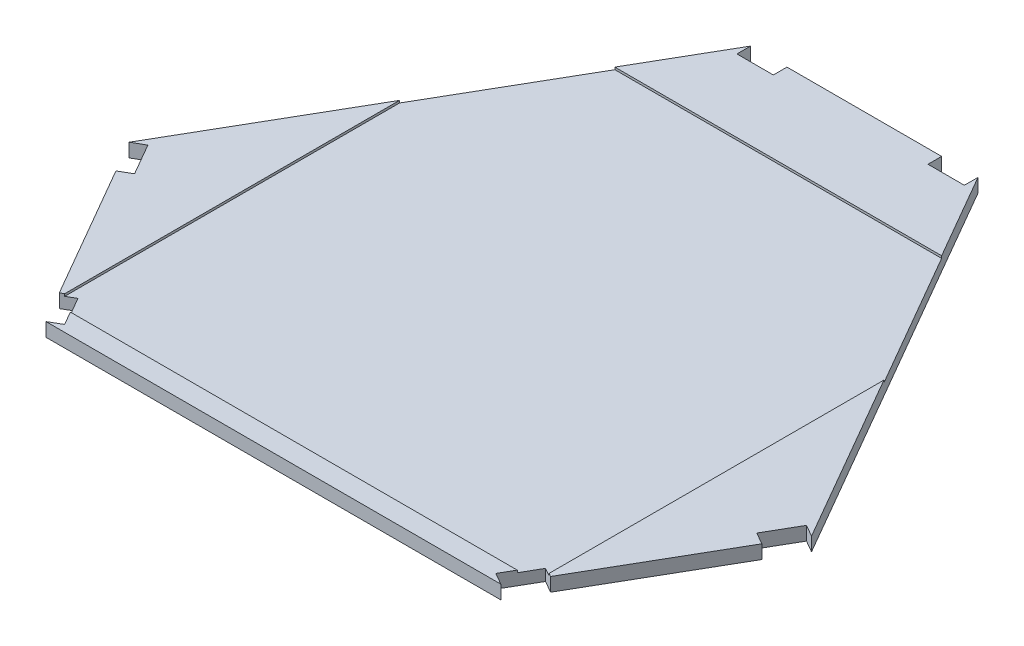
ISO-10303-21;
HEADER;
FILE_DESCRIPTION(('STEP AP214'),'2;1');
FILE_NAME('part.step','',(''),(''),'','','');
FILE_SCHEMA(('AUTOMOTIVE_DESIGN { 1 0 10303 214 1 1 1 1 }'));
ENDSEC;
DATA;
#1=APPLICATION_CONTEXT('core data for automotive mechanical design processes');
#2=APPLICATION_PROTOCOL_DEFINITION('international standard','automotive_design',2000,#1);
#3=PRODUCT_CONTEXT('',#1,'mechanical');
#4=PRODUCT('Part','Part','',(#3));
#5=PRODUCT_RELATED_PRODUCT_CATEGORY('part','',(#4));
#6=PRODUCT_DEFINITION_FORMATION('','',#4);
#7=PRODUCT_DEFINITION_CONTEXT('part definition',#1,'design');
#8=PRODUCT_DEFINITION('design','',#6,#7);
#9=PRODUCT_DEFINITION_SHAPE('','',#8);
#10=(LENGTH_UNIT() NAMED_UNIT(*) SI_UNIT(.MILLI.,.METRE.));
#11=(NAMED_UNIT(*) PLANE_ANGLE_UNIT() SI_UNIT($,.RADIAN.));
#12=(NAMED_UNIT(*) SI_UNIT($,.STERADIAN.) SOLID_ANGLE_UNIT());
#13=UNCERTAINTY_MEASURE_WITH_UNIT(LENGTH_MEASURE(1.E-05),#10,'distance_accuracy_value','');
#14=(GEOMETRIC_REPRESENTATION_CONTEXT(3) GLOBAL_UNCERTAINTY_ASSIGNED_CONTEXT((#13)) GLOBAL_UNIT_ASSIGNED_CONTEXT((#10,
#11,#12)) REPRESENTATION_CONTEXT('',''));
#15=CARTESIAN_POINT('',(0.,0.,0.));
#16=DIRECTION('',(0.,0.,1.));
#17=DIRECTION('',(1.,0.,0.));
#18=AXIS2_PLACEMENT_3D('',#15,#16,#17);
#19=CARTESIAN_POINT('',(0.,0.,0.));
#20=DIRECTION('',(0.,-1.,0.));
#21=DIRECTION('',(0.,0.,-1.));
#22=AXIS2_PLACEMENT_3D('',#19,#20,#21);
#23=PLANE('',#22);
#24=DIRECTION('',(0.866025403784436,0.,-0.500000000000004));
#25=VECTOR('',#24,1.);
#26=CARTESIAN_POINT('',(-74.9999999999997,0.,14.4337572661108));
#27=LINE('',#26,#25);
#28=CARTESIAN_POINT('',(-74.9999999999997,0.,14.4337572661108));
#29=VERTEX_POINT('',#28);
#30=CARTESIAN_POINT('',(-72.4019237886464,0.,12.9337572661108));
#31=VERTEX_POINT('',#30);
#32=EDGE_CURVE('E250',#29,#31,#27,.T.);
#33=ORIENTED_EDGE('',*,*,#32,.F.);
#34=DIRECTION('',(-0.499999999999997,0.,0.866025403784441));
#35=VECTOR('',#34,1.);
#36=CARTESIAN_POINT('',(-75.0000004645097,0.,14.4337564615561));
#37=LINE('',#36,#35);
#38=CARTESIAN_POINT('',(-24.99999953549,0.,-72.1687839168879));
#39=VERTEX_POINT('',#38);
#40=EDGE_CURVE('E430',#39,#29,#37,.T.);
#41=ORIENTED_EDGE('',*,*,#40,.F.);
#42=DIRECTION('',(0.,0.,1.));
#43=VECTOR('',#42,1.);
#44=CARTESIAN_POINT('',(-24.99999953549,0.,-72.1687839168879));
#45=LINE('',#44,#43);
#46=CARTESIAN_POINT('',(-24.99999953549,0.,-69.1687839168879));
#47=VERTEX_POINT('',#46);
#48=EDGE_CURVE('E359',#39,#47,#45,.T.);
#49=ORIENTED_EDGE('',*,*,#48,.T.);
#50=DIRECTION('',(1.,0.,0.));
#51=VECTOR('',#50,1.);
#52=CARTESIAN_POINT('',(-24.99999953549,0.,-69.1687839168879));
#53=LINE('',#52,#51);
#54=CARTESIAN_POINT('',(-16.99999953549,0.,-69.1687839168879));
#55=VERTEX_POINT('',#54);
#56=EDGE_CURVE('E363',#47,#55,#53,.T.);
#57=ORIENTED_EDGE('',*,*,#56,.T.);
#58=DIRECTION('',(0.,0.,-1.));
#59=VECTOR('',#58,1.);
#60=CARTESIAN_POINT('',(-16.99999953549,0.,-72.1687839168879));
#61=LINE('',#60,#59);
#62=CARTESIAN_POINT('',(-16.99999953549,0.,-72.1687839168879));
#63=VERTEX_POINT('',#62);
#64=EDGE_CURVE('E370',#55,#63,#61,.T.);
#65=ORIENTED_EDGE('',*,*,#64,.T.);
#66=DIRECTION('',(-1.,0.,0.));
#67=VECTOR('',#66,1.);
#68=CARTESIAN_POINT('',(-25.00000046451,0.,-72.1687839168879));
#69=LINE('',#68,#67);
#70=CARTESIAN_POINT('',(16.99999953549,0.,-72.1687839168879));
#71=VERTEX_POINT('',#70);
#72=EDGE_CURVE('E461',#71,#63,#69,.T.);
#73=ORIENTED_EDGE('',*,*,#72,.F.);
#74=DIRECTION('',(0.,0.,-1.));
#75=VECTOR('',#74,1.);
#76=CARTESIAN_POINT('',(16.99999953549,0.,-72.1687839168879));
#77=LINE('',#76,#75);
#78=CARTESIAN_POINT('',(16.99999953549,0.,-69.1687839168879));
#79=VERTEX_POINT('',#78);
#80=EDGE_CURVE('E386',#79,#71,#77,.T.);
#81=ORIENTED_EDGE('',*,*,#80,.F.);
#82=DIRECTION('',(-1.,0.,0.));
#83=VECTOR('',#82,1.);
#84=CARTESIAN_POINT('',(24.99999953549,0.,-69.1687839168879));
#85=LINE('',#84,#83);
#86=CARTESIAN_POINT('',(24.99999953549,0.,-69.1687839168879));
#87=VERTEX_POINT('',#86);
#88=EDGE_CURVE('E394',#87,#79,#85,.T.);
#89=ORIENTED_EDGE('',*,*,#88,.F.);
#90=DIRECTION('',(0.,0.,1.));
#91=VECTOR('',#90,1.);
#92=CARTESIAN_POINT('',(24.99999953549,0.,-72.1687839168879));
#93=LINE('',#92,#91);
#94=CARTESIAN_POINT('',(24.99999953549,0.,-72.1687839168879));
#95=VERTEX_POINT('',#94);
#96=EDGE_CURVE('E378',#95,#87,#93,.T.);
#97=ORIENTED_EDGE('',*,*,#96,.F.);
#98=DIRECTION('',(-0.500000013935296,0.,-0.866025395738891));
#99=VECTOR('',#98,1.);
#100=CARTESIAN_POINT('',(24.99999953549,0.,-72.1687839168879));
#101=LINE('',#100,#99);
#102=CARTESIAN_POINT('',(75.0000013935296,0.,14.4337564615561));
#103=VERTEX_POINT('',#102);
#104=EDGE_CURVE('E458',#103,#95,#101,.T.);
#105=ORIENTED_EDGE('',*,*,#104,.F.);
#106=DIRECTION('',(-0.866025403784443,0.,-0.499999999999992));
#107=VECTOR('',#106,1.);
#108=CARTESIAN_POINT('',(74.9999999999999,0.,14.4337572661098));
#109=LINE('',#108,#107);
#110=CARTESIAN_POINT('',(72.4019237886466,0.,12.9337572661098));
#111=VERTEX_POINT('',#110);
#112=EDGE_CURVE('E305',#103,#111,#109,.T.);
#113=ORIENTED_EDGE('',*,*,#112,.T.);
#114=DIRECTION('',(-0.499999999999992,0.,0.866025403784443));
#115=VECTOR('',#114,1.);
#116=CARTESIAN_POINT('',(72.4019237886466,0.,12.9337572661098));
#117=LINE('',#116,#115);
#118=CARTESIAN_POINT('',(68.4019237886467,0.,19.8619604963853));
#119=VERTEX_POINT('',#118);
#120=EDGE_CURVE('E309',#111,#119,#117,.T.);
#121=ORIENTED_EDGE('',*,*,#120,.T.);
#122=DIRECTION('',(0.866025403784443,0.,0.499999999999992));
#123=VECTOR('',#122,1.);
#124=CARTESIAN_POINT('',(71.,0.,21.3619604963853));
#125=LINE('',#124,#123);
#126=CARTESIAN_POINT('',(71.,0.,21.3619604963853));
#127=VERTEX_POINT('',#126);
#128=EDGE_CURVE('E317',#119,#127,#125,.T.);
#129=ORIENTED_EDGE('',*,*,#128,.T.);
#130=DIRECTION('',(0.500000027870608,0.,-0.866025387693335));
#131=VECTOR('',#130,1.);
#132=CARTESIAN_POINT('',(75.0000013935296,0.,14.4337564615561));
#133=LINE('',#132,#131);
#134=CARTESIAN_POINT('',(54.0000004645102,0.,50.8068234205015));
#135=VERTEX_POINT('',#134);
#136=EDGE_CURVE('E456',#135,#127,#133,.T.);
#137=ORIENTED_EDGE('',*,*,#136,.F.);
#138=DIRECTION('',(0.866025403784443,0.,0.499999999999992));
#139=VECTOR('',#138,1.);
#140=CARTESIAN_POINT('',(54.0000004645102,0.,50.8068234205015));
#141=LINE('',#140,#139);
#142=CARTESIAN_POINT('',(51.4019242531569,0.,49.3068234205015));
#143=VERTEX_POINT('',#142);
#144=EDGE_CURVE('E286',#143,#135,#141,.T.);
#145=ORIENTED_EDGE('',*,*,#144,.F.);
#146=DIRECTION('',(0.499999999999992,0.,-0.866025403784443));
#147=VECTOR('',#146,1.);
#148=CARTESIAN_POINT('',(47.401924253157,0.,56.2350266507771));
#149=LINE('',#148,#147);
#150=CARTESIAN_POINT('',(47.401924253157,0.,56.2350266507771));
#151=VERTEX_POINT('',#150);
#152=EDGE_CURVE('E293',#151,#143,#149,.T.);
#153=ORIENTED_EDGE('',*,*,#152,.F.);
#154=DIRECTION('',(-0.866025403784443,0.,-0.499999999999992));
#155=VECTOR('',#154,1.);
#156=CARTESIAN_POINT('',(50.0000004645103,0.,57.735026650777));
#157=LINE('',#156,#155);
#158=CARTESIAN_POINT('',(50.0000004645103,0.,57.735026650777));
#159=VERTEX_POINT('',#158);
#160=EDGE_CURVE('E290',#159,#151,#157,.T.);
#161=ORIENTED_EDGE('',*,*,#160,.F.);
#162=DIRECTION('',(1.,0.,0.));
#163=VECTOR('',#162,1.);
#164=CARTESIAN_POINT('',(49.9999990709794,0.,57.7350274553323));
#165=LINE('',#164,#163);
#166=CARTESIAN_POINT('',(-50.0000004645095,0.,57.7350266507777));
#167=VERTEX_POINT('',#166);
#168=EDGE_CURVE('E453',#167,#159,#165,.T.);
#169=ORIENTED_EDGE('',*,*,#168,.F.);
#170=DIRECTION('',(0.866025403784436,0.,-0.500000000000004));
#171=VECTOR('',#170,1.);
#172=CARTESIAN_POINT('',(-50.0000004645095,0.,57.7350266507777));
#173=LINE('',#172,#171);
#174=CARTESIAN_POINT('',(-47.4019242531562,0.,56.2350266507777));
#175=VERTEX_POINT('',#174);
#176=EDGE_CURVE('E325',#167,#175,#173,.T.);
#177=ORIENTED_EDGE('',*,*,#176,.T.);
#178=DIRECTION('',(-0.500000000000004,0.,-0.866025403784436));
#179=VECTOR('',#178,1.);
#180=CARTESIAN_POINT('',(-47.4019242531562,0.,56.2350266507777));
#181=LINE('',#180,#179);
#182=CARTESIAN_POINT('',(-51.4019242531562,0.,49.3068234205022));
#183=VERTEX_POINT('',#182);
#184=EDGE_CURVE('E333',#175,#183,#181,.T.);
#185=ORIENTED_EDGE('',*,*,#184,.T.);
#186=DIRECTION('',(-0.866025403784436,0.,0.500000000000004));
#187=VECTOR('',#186,1.);
#188=CARTESIAN_POINT('',(-54.0000004645095,0.,50.8068234205022));
#189=LINE('',#188,#187);
#190=CARTESIAN_POINT('',(-54.0000004645095,0.,50.8068234205022));
#191=VERTEX_POINT('',#190);
#192=EDGE_CURVE('E341',#183,#191,#189,.T.);
#193=ORIENTED_EDGE('',*,*,#192,.T.);
#194=DIRECTION('',(0.50000000000001,0.,0.866025403784433));
#195=VECTOR('',#194,1.);
#196=CARTESIAN_POINT('',(-49.9999999999994,0.,57.7350274553323));
#197=LINE('',#196,#195);
#198=CARTESIAN_POINT('',(-70.9999999999997,0.,21.3619604963863));
#199=VERTEX_POINT('',#198);
#200=EDGE_CURVE('E451',#199,#191,#197,.T.);
#201=ORIENTED_EDGE('',*,*,#200,.F.);
#202=DIRECTION('',(-0.866025403784436,0.,0.500000000000004));
#203=VECTOR('',#202,1.);
#204=CARTESIAN_POINT('',(-70.9999999999997,0.,21.3619604963863));
#205=LINE('',#204,#203);
#206=CARTESIAN_POINT('',(-68.4019237886464,0.,19.8619604963863));
#207=VERTEX_POINT('',#206);
#208=EDGE_CURVE('E268',#207,#199,#205,.T.);
#209=ORIENTED_EDGE('',*,*,#208,.F.);
#210=DIRECTION('',(0.500000000000004,0.,0.866025403784436));
#211=VECTOR('',#210,1.);
#212=CARTESIAN_POINT('',(-72.4019237886464,0.,12.9337572661108));
#213=LINE('',#212,#211);
#214=EDGE_CURVE('E270',#31,#207,#213,.T.);
#215=ORIENTED_EDGE('',*,*,#214,.F.);
#216=EDGE_LOOP('',(#33,#41,#49,#57,#65,#73,#81,#89,#97,#105,#113,#121,#129,#137,#145,#153,#161,
#169,#177,#185,#193,#201,#209,#215));
#217=FACE_BOUND('',#216,.T.);
#218=ADVANCED_FACE('F33',(#217),#23,.T.);
#219=CARTESIAN_POINT('',(0.,3.,0.));
#220=DIRECTION('',(0.,-1.,0.));
#221=DIRECTION('',(0.,0.,-1.));
#222=AXIS2_PLACEMENT_3D('',#219,#220,#221);
#223=PLANE('',#222);
#224=DIRECTION('',(0.,0.,1.));
#225=VECTOR('',#224,1.);
#226=CARTESIAN_POINT('',(53.25,3.,0.));
#227=LINE('',#226,#225);
#228=CARTESIAN_POINT('',(53.25,3.,-23.2383496168059));
#229=VERTEX_POINT('',#228);
#230=CARTESIAN_POINT('',(53.25,3.,50.3738104504241));
#231=VERTEX_POINT('',#230);
#232=EDGE_CURVE('E479',#229,#231,#227,.T.);
#233=ORIENTED_EDGE('',*,*,#232,.T.);
#234=DIRECTION('',(0.866025403784443,0.,0.499999999999992));
#235=VECTOR('',#234,1.);
#236=CARTESIAN_POINT('',(54.0000004645102,3.,50.8068234205015));
#237=LINE('',#236,#235);
#238=CARTESIAN_POINT('',(54.0000004645102,3.,50.8068234205015));
#239=VERTEX_POINT('',#238);
#240=EDGE_CURVE('E48',#231,#239,#237,.T.);
#241=ORIENTED_EDGE('',*,*,#240,.T.);
#242=DIRECTION('',(0.500000027870608,0.,-0.866025387693335));
#243=VECTOR('',#242,1.);
#244=CARTESIAN_POINT('',(75.0000013935296,3.,14.4337564615561));
#245=LINE('',#244,#243);
#246=CARTESIAN_POINT('',(71.,3.,21.3619604963853));
#247=VERTEX_POINT('',#246);
#248=EDGE_CURVE('E439',#239,#247,#245,.T.);
#249=ORIENTED_EDGE('',*,*,#248,.T.);
#250=DIRECTION('',(0.866025403784443,0.,0.499999999999992));
#251=VECTOR('',#250,1.);
#252=CARTESIAN_POINT('',(71.,3.,21.3619604963853));
#253=LINE('',#252,#251);
#254=CARTESIAN_POINT('',(68.4019237886467,3.,19.8619604963853));
#255=VERTEX_POINT('',#254);
#256=EDGE_CURVE('E308',#255,#247,#253,.T.);
#257=ORIENTED_EDGE('',*,*,#256,.F.);
#258=DIRECTION('',(-0.499999999999992,0.,0.866025403784443));
#259=VECTOR('',#258,1.);
#260=CARTESIAN_POINT('',(72.4019237886466,3.,12.9337572661098));
#261=LINE('',#260,#259);
#262=CARTESIAN_POINT('',(72.4019237886466,3.,12.9337572661098));
#263=VERTEX_POINT('',#262);
#264=EDGE_CURVE('E312',#263,#255,#261,.T.);
#265=ORIENTED_EDGE('',*,*,#264,.F.);
#266=DIRECTION('',(-0.866025403784443,0.,-0.499999999999992));
#267=VECTOR('',#266,1.);
#268=CARTESIAN_POINT('',(74.9999999999999,3.,14.4337572661098));
#269=LINE('',#268,#267);
#270=CARTESIAN_POINT('',(74.9999999999999,3.,14.4337572661098));
#271=VERTEX_POINT('',#270);
#272=EDGE_CURVE('E306',#271,#263,#269,.T.);
#273=ORIENTED_EDGE('',*,*,#272,.F.);
#274=DIRECTION('',(-0.500000013935296,0.,-0.866025395738891));
#275=VECTOR('',#274,1.);
#276=CARTESIAN_POINT('',(24.99999953549,3.,-72.1687839168879));
#277=LINE('',#276,#275);
#278=EDGE_CURVE('E442',#271,#229,#277,.T.);
#279=ORIENTED_EDGE('',*,*,#278,.T.);
#280=EDGE_LOOP('',(#233,#241,#249,#257,#265,#273,#279));
#281=FACE_BOUND('',#280,.T.);
#282=ADVANCED_FACE('F498',(#281),#223,.F.);
#283=CARTESIAN_POINT('',(75.0000013935296,3.,14.4337564615561));
#284=DIRECTION('',(-0.866025387693335,0.,-0.500000027870608));
#285=DIRECTION('',(-0.500000027870608,0.,0.866025387693335));
#286=AXIS2_PLACEMENT_3D('',#283,#284,#285);
#287=PLANE('',#286);
#288=ORIENTED_EDGE('',*,*,#248,.F.);
#289=DIRECTION('',(0.,-1.,0.));
#290=VECTOR('',#289,1.);
#291=CARTESIAN_POINT('',(54.0000004645102,3.,50.8068234205015));
#292=LINE('',#291,#290);
#293=EDGE_CURVE('E275',#239,#135,#292,.T.);
#294=ORIENTED_EDGE('',*,*,#293,.T.);
#295=ORIENTED_EDGE('',*,*,#136,.T.);
#296=DIRECTION('',(0.,-1.,0.));
#297=VECTOR('',#296,1.);
#298=CARTESIAN_POINT('',(71.,3.,21.3619604963853));
#299=LINE('',#298,#297);
#300=EDGE_CURVE('E314',#247,#127,#299,.T.);
#301=ORIENTED_EDGE('',*,*,#300,.F.);
#302=EDGE_LOOP('',(#288,#294,#295,#301));
#303=FACE_BOUND('',#302,.T.);
#304=ADVANCED_FACE('F573',(#303),#287,.F.);
#305=DIRECTION('',(-0.499999999999997,0.,0.866025403784441));
#306=VECTOR('',#305,1.);
#307=CARTESIAN_POINT('',(-75.0000004645097,3.,14.4337564615561));
#308=LINE('',#307,#306);
#309=CARTESIAN_POINT('',(-53.25,3.,-23.2383494076216));
#310=VERTEX_POINT('',#309);
#311=CARTESIAN_POINT('',(-75.0000004645097,3.,14.4337564615561));
#312=VERTEX_POINT('',#311);
#313=EDGE_CURVE('E266',#310,#312,#308,.T.);
#314=ORIENTED_EDGE('',*,*,#313,.T.);
#315=DIRECTION('',(0.866025403784436,0.,-0.500000000000004));
#316=VECTOR('',#315,1.);
#317=CARTESIAN_POINT('',(-74.9999999999997,3.,14.4337572661108));
#318=LINE('',#317,#316);
#319=CARTESIAN_POINT('',(-72.4019237886464,3.,12.9337572661108));
#320=VERTEX_POINT('',#319);
#321=EDGE_CURVE('E247',#312,#320,#318,.T.);
#322=ORIENTED_EDGE('',*,*,#321,.T.);
#323=DIRECTION('',(0.500000000000004,0.,0.866025403784436));
#324=VECTOR('',#323,1.);
#325=CARTESIAN_POINT('',(-72.4019237886464,3.,12.9337572661108));
#326=LINE('',#325,#324);
#327=CARTESIAN_POINT('',(-68.4019237886464,3.,19.8619604963863));
#328=VERTEX_POINT('',#327);
#329=EDGE_CURVE('E258',#320,#328,#326,.T.);
#330=ORIENTED_EDGE('',*,*,#329,.T.);
#331=DIRECTION('',(-0.866025403784436,0.,0.500000000000004));
#332=VECTOR('',#331,1.);
#333=CARTESIAN_POINT('',(-70.9999999999997,3.,21.3619604963863));
#334=LINE('',#333,#332);
#335=CARTESIAN_POINT('',(-70.9999999999997,3.,21.3619604963863));
#336=VERTEX_POINT('',#335);
#337=EDGE_CURVE('E255',#328,#336,#334,.T.);
#338=ORIENTED_EDGE('',*,*,#337,.T.);
#339=DIRECTION('',(0.50000000000001,0.,0.866025403784433));
#340=VECTOR('',#339,1.);
#341=CARTESIAN_POINT('',(-49.9999999999994,3.,57.7350274553323));
#342=LINE('',#341,#340);
#343=CARTESIAN_POINT('',(-54.0000004645095,3.,50.8068234205022));
#344=VERTEX_POINT('',#343);
#345=EDGE_CURVE('E434',#336,#344,#342,.T.);
#346=ORIENTED_EDGE('',*,*,#345,.T.);
#347=DIRECTION('',(-0.866025403784436,0.,0.500000000000004));
#348=VECTOR('',#347,1.);
#349=CARTESIAN_POINT('',(-54.0000004645095,3.,50.8068234205022));
#350=LINE('',#349,#348);
#351=CARTESIAN_POINT('',(-53.25,3.,50.3738104504253));
#352=VERTEX_POINT('',#351);
#353=EDGE_CURVE('E332',#352,#344,#350,.T.);
#354=ORIENTED_EDGE('',*,*,#353,.F.);
#355=DIRECTION('',(0.,0.,-1.));
#356=VECTOR('',#355,1.);
#357=CARTESIAN_POINT('',(-53.25,3.,0.));
#358=LINE('',#357,#356);
#359=EDGE_CURVE('E485',#352,#310,#358,.T.);
#360=ORIENTED_EDGE('',*,*,#359,.T.);
#361=EDGE_LOOP('',(#314,#322,#330,#338,#346,#354,#360));
#362=FACE_BOUND('',#361,.T.);
#363=ADVANCED_FACE('F264',(#362),#223,.F.);
#364=CARTESIAN_POINT('',(-49.9999999999994,3.,57.7350274553323));
#365=DIRECTION('',(0.866025403784433,0.,-0.50000000000001));
#366=DIRECTION('',(-0.50000000000001,0.,-0.866025403784433));
#367=AXIS2_PLACEMENT_3D('',#364,#365,#366);
#368=PLANE('',#367);
#369=ORIENTED_EDGE('',*,*,#345,.F.);
#370=DIRECTION('',(0.,-1.,0.));
#371=VECTOR('',#370,1.);
#372=CARTESIAN_POINT('',(-70.9999999999997,3.,21.3619604963863));
#373=LINE('',#372,#371);
#374=EDGE_CURVE('E277',#336,#199,#373,.T.);
#375=ORIENTED_EDGE('',*,*,#374,.T.);
#376=ORIENTED_EDGE('',*,*,#200,.T.);
#377=DIRECTION('',(0.,-1.,0.));
#378=VECTOR('',#377,1.);
#379=CARTESIAN_POINT('',(-54.0000004645095,3.,50.8068234205022));
#380=LINE('',#379,#378);
#381=EDGE_CURVE('E338',#344,#191,#380,.T.);
#382=ORIENTED_EDGE('',*,*,#381,.F.);
#383=EDGE_LOOP('',(#369,#375,#376,#382));
#384=FACE_BOUND('',#383,.T.);
#385=ADVANCED_FACE('F538',(#384),#368,.F.);
#386=DIRECTION('',(1.,0.,0.));
#387=VECTOR('',#386,1.);
#388=CARTESIAN_POINT('',(49.9999990709794,3.,57.7350274553323));
#389=LINE('',#388,#387);
#390=CARTESIAN_POINT('',(-50.0000004645095,3.,57.7350266507777));
#391=VERTEX_POINT('',#390);
#392=CARTESIAN_POINT('',(50.0000004645103,3.,57.735026650777));
#393=VERTEX_POINT('',#392);
#394=EDGE_CURVE('E436',#391,#393,#389,.T.);
#395=ORIENTED_EDGE('',*,*,#394,.T.);
#396=DIRECTION('',(-0.866025403784443,0.,-0.499999999999992));
#397=VECTOR('',#396,1.);
#398=CARTESIAN_POINT('',(50.0000004645103,3.,57.735026650777));
#399=LINE('',#398,#397);
#400=CARTESIAN_POINT('',(47.401924253157,3.,56.2350266507771));
#401=VERTEX_POINT('',#400);
#402=EDGE_CURVE('E282',#393,#401,#399,.T.);
#403=ORIENTED_EDGE('',*,*,#402,.T.);
#404=DIRECTION('',(0.499999999999992,0.,-0.866025403784443));
#405=VECTOR('',#404,1.);
#406=CARTESIAN_POINT('',(47.401924253157,3.,56.2350266507771));
#407=LINE('',#406,#405);
#408=CARTESIAN_POINT('',(49.1253301935213,3.,53.25));
#409=VERTEX_POINT('',#408);
#410=EDGE_CURVE('E285',#401,#409,#407,.T.);
#411=ORIENTED_EDGE('',*,*,#410,.T.);
#412=DIRECTION('',(-1.,0.,0.));
#413=VECTOR('',#412,1.);
#414=CARTESIAN_POINT('',(0.,3.,53.25));
#415=LINE('',#414,#413);
#416=CARTESIAN_POINT('',(-49.1253301935209,3.,53.25));
#417=VERTEX_POINT('',#416);
#418=EDGE_CURVE('E56',#409,#417,#415,.T.);
#419=ORIENTED_EDGE('',*,*,#418,.T.);
#420=DIRECTION('',(-0.500000000000004,0.,-0.866025403784436));
#421=VECTOR('',#420,1.);
#422=CARTESIAN_POINT('',(-47.4019242531562,3.,56.2350266507777));
#423=LINE('',#422,#421);
#424=CARTESIAN_POINT('',(-47.4019242531562,3.,56.2350266507777));
#425=VERTEX_POINT('',#424);
#426=EDGE_CURVE('E336',#425,#417,#423,.T.);
#427=ORIENTED_EDGE('',*,*,#426,.F.);
#428=DIRECTION('',(0.866025403784436,0.,-0.500000000000004));
#429=VECTOR('',#428,1.);
#430=CARTESIAN_POINT('',(-50.0000004645095,3.,57.7350266507777));
#431=LINE('',#430,#429);
#432=EDGE_CURVE('E330',#391,#425,#431,.T.);
#433=ORIENTED_EDGE('',*,*,#432,.F.);
#434=EDGE_LOOP('',(#395,#403,#411,#419,#427,#433));
#435=FACE_BOUND('',#434,.T.);
#436=ADVANCED_FACE('F561',(#435),#223,.F.);
#437=CARTESIAN_POINT('',(0.,2.5,0.));
#438=DIRECTION('',(0.,1.,0.));
#439=DIRECTION('',(0.,0.,1.));
#440=AXIS2_PLACEMENT_3D('',#437,#438,#439);
#441=PLANE('',#440);
#442=DIRECTION('',(-0.866025403784443,0.,-0.499999999999992));
#443=VECTOR('',#442,1.);
#444=CARTESIAN_POINT('',(-8.49999976774487,2.5,14.7224314620581));
#445=LINE('',#444,#443);
#446=CARTESIAN_POINT('',(53.25,2.5,50.3738104504241));
#447=VERTEX_POINT('',#446);
#448=CARTESIAN_POINT('',(51.4019242531569,2.5,49.3068234205015));
#449=VERTEX_POINT('',#448);
#450=EDGE_CURVE('E280',#447,#449,#445,.T.);
#451=ORIENTED_EDGE('',*,*,#450,.F.);
#452=DIRECTION('',(0.,0.,-1.));
#453=VECTOR('',#452,1.);
#454=CARTESIAN_POINT('',(53.25,2.5,53.25));
#455=LINE('',#454,#453);
#456=CARTESIAN_POINT('',(53.25,2.5,-23.2383496168059));
#457=VERTEX_POINT('',#456);
#458=EDGE_CURVE('E411',#447,#457,#455,.T.);
#459=ORIENTED_EDGE('',*,*,#458,.T.);
#460=DIRECTION('',(-0.500000013935296,0.,-0.866025395738891));
#461=VECTOR('',#460,1.);
#462=CARTESIAN_POINT('',(24.99999953549,2.5,-72.1687839168879));
#463=LINE('',#462,#461);
#464=CARTESIAN_POINT('',(35.9227649285442,2.5,-53.25));
#465=VERTEX_POINT('',#464);
#466=EDGE_CURVE('E487',#457,#465,#463,.T.);
#467=ORIENTED_EDGE('',*,*,#466,.T.);
#468=DIRECTION('',(-1.,0.,0.));
#469=VECTOR('',#468,1.);
#470=CARTESIAN_POINT('',(53.25,2.5,-53.25));
#471=LINE('',#470,#469);
#472=CARTESIAN_POINT('',(-35.9227654516655,2.5,-53.25));
#473=VERTEX_POINT('',#472);
#474=EDGE_CURVE('E413',#465,#473,#471,.T.);
#475=ORIENTED_EDGE('',*,*,#474,.T.);
#476=DIRECTION('',(-0.499999999999997,0.,0.86602540378444));
#477=VECTOR('',#476,1.);
#478=CARTESIAN_POINT('',(-75.0000004645097,2.5,14.4337564615561));
#479=LINE('',#478,#477);
#480=CARTESIAN_POINT('',(-53.25,2.5,-23.2383494076217));
#481=VERTEX_POINT('',#480);
#482=EDGE_CURVE('E428',#473,#481,#479,.T.);
#483=ORIENTED_EDGE('',*,*,#482,.T.);
#484=DIRECTION('',(0.,0.,1.));
#485=VECTOR('',#484,1.);
#486=CARTESIAN_POINT('',(-53.25,2.5,53.25));
#487=LINE('',#486,#485);
#488=CARTESIAN_POINT('',(-53.25,2.5,50.3738104504253));
#489=VERTEX_POINT('',#488);
#490=EDGE_CURVE('E401',#481,#489,#487,.T.);
#491=ORIENTED_EDGE('',*,*,#490,.T.);
#492=DIRECTION('',(0.866025403784436,0.,-0.500000000000004));
#493=VECTOR('',#492,1.);
#494=CARTESIAN_POINT('',(8.49999976774507,2.5,14.722431462058));
#495=LINE('',#494,#493);
#496=CARTESIAN_POINT('',(-51.4019242531562,2.5,49.3068234205022));
#497=VERTEX_POINT('',#496);
#498=EDGE_CURVE('E356',#489,#497,#495,.T.);
#499=ORIENTED_EDGE('',*,*,#498,.T.);
#500=DIRECTION('',(0.500000000000004,0.,0.866025403784436));
#501=VECTOR('',#500,1.);
#502=CARTESIAN_POINT('',(-59.9019240209013,2.5,34.5843919584443));
#503=LINE('',#502,#501);
#504=CARTESIAN_POINT('',(-49.1253301935209,2.5,53.25));
#505=VERTEX_POINT('',#504);
#506=EDGE_CURVE('E349',#497,#505,#503,.T.);
#507=ORIENTED_EDGE('',*,*,#506,.T.);
#508=DIRECTION('',(1.,0.,0.));
#509=VECTOR('',#508,1.);
#510=CARTESIAN_POINT('',(53.25,2.5,53.25));
#511=LINE('',#510,#509);
#512=CARTESIAN_POINT('',(49.1253301935213,2.5,53.25));
#513=VERTEX_POINT('',#512);
#514=EDGE_CURVE('E408',#505,#513,#511,.T.);
#515=ORIENTED_EDGE('',*,*,#514,.T.);
#516=DIRECTION('',(-0.499999999999992,0.,0.866025403784443));
#517=VECTOR('',#516,1.);
#518=CARTESIAN_POINT('',(59.9019240209018,2.5,34.5843919584434));
#519=LINE('',#518,#517);
#520=EDGE_CURVE('E303',#449,#513,#519,.T.);
#521=ORIENTED_EDGE('',*,*,#520,.F.);
#522=EDGE_LOOP('',(#451,#459,#467,#475,#483,#491,#499,#507,#515,#521));
#523=FACE_BOUND('',#522,.T.);
#524=ADVANCED_FACE('F510',(#523),#441,.T.);
#525=CARTESIAN_POINT('',(-53.25,2.5,53.25));
#526=DIRECTION('',(-1.,0.,0.));
#527=DIRECTION('',(0.,0.,1.));
#528=AXIS2_PLACEMENT_3D('',#525,#526,#527);
#529=PLANE('',#528);
#530=DIRECTION('',(0.,1.,0.));
#531=VECTOR('',#530,1.);
#532=CARTESIAN_POINT('',(-53.25,2.5,50.3738104504253));
#533=LINE('',#532,#531);
#534=EDGE_CURVE('E491',#489,#352,#533,.T.);
#535=ORIENTED_EDGE('',*,*,#534,.F.);
#536=ORIENTED_EDGE('',*,*,#490,.F.);
#537=DIRECTION('',(0.,-1.,0.));
#538=VECTOR('',#537,1.);
#539=CARTESIAN_POINT('',(-53.25,3.,-23.2383494076216));
#540=LINE('',#539,#538);
#541=EDGE_CURVE('E425',#310,#481,#540,.T.);
#542=ORIENTED_EDGE('',*,*,#541,.F.);
#543=ORIENTED_EDGE('',*,*,#359,.F.);
#544=EDGE_LOOP('',(#535,#536,#542,#543));
#545=FACE_BOUND('',#544,.T.);
#546=ADVANCED_FACE('F549',(#545),#529,.F.);
#547=CARTESIAN_POINT('',(53.25,2.5,53.25));
#548=DIRECTION('',(0.,0.,1.));
#549=DIRECTION('',(1.,0.,0.));
#550=AXIS2_PLACEMENT_3D('',#547,#548,#549);
#551=PLANE('',#550);
#552=ORIENTED_EDGE('',*,*,#418,.F.);
#553=DIRECTION('',(0.,-1.,0.));
#554=VECTOR('',#553,1.);
#555=CARTESIAN_POINT('',(49.1253301935213,2.5,53.25));
#556=LINE('',#555,#554);
#557=EDGE_CURVE('E11',#409,#513,#556,.T.);
#558=ORIENTED_EDGE('',*,*,#557,.T.);
#559=ORIENTED_EDGE('',*,*,#514,.F.);
#560=DIRECTION('',(0.,-1.,0.));
#561=VECTOR('',#560,1.);
#562=CARTESIAN_POINT('',(-49.1253301935209,2.5,53.25));
#563=LINE('',#562,#561);
#564=EDGE_CURVE('E489',#417,#505,#563,.T.);
#565=ORIENTED_EDGE('',*,*,#564,.F.);
#566=EDGE_LOOP('',(#552,#558,#559,#565));
#567=FACE_BOUND('',#566,.T.);
#568=ADVANCED_FACE('F556',(#567),#551,.F.);
#569=DIRECTION('',(0.,0.,1.));
#570=VECTOR('',#569,1.);
#571=CARTESIAN_POINT('',(-24.99999953549,3.,-72.1687839168879));
#572=LINE('',#571,#570);
#573=CARTESIAN_POINT('',(-24.99999953549,3.,-72.1687839168879));
#574=VERTEX_POINT('',#573);
#575=CARTESIAN_POINT('',(-24.99999953549,3.,-69.1687839168879));
#576=VERTEX_POINT('',#575);
#577=EDGE_CURVE('E360',#574,#576,#572,.T.);
#578=ORIENTED_EDGE('',*,*,#577,.F.);
#579=CARTESIAN_POINT('',(-35.9227654516655,3.,-53.25));
#580=VERTEX_POINT('',#579);
#581=EDGE_CURVE('E431',#574,#580,#308,.T.);
#582=ORIENTED_EDGE('',*,*,#581,.T.);
#583=DIRECTION('',(1.,0.,0.));
#584=VECTOR('',#583,1.);
#585=CARTESIAN_POINT('',(0.,3.,-53.25));
#586=LINE('',#585,#584);
#587=CARTESIAN_POINT('',(35.9227649285442,3.,-53.25));
#588=VERTEX_POINT('',#587);
#589=EDGE_CURVE('E482',#580,#588,#586,.T.);
#590=ORIENTED_EDGE('',*,*,#589,.T.);
#591=CARTESIAN_POINT('',(24.99999953549,3.,-72.1687839168879));
#592=VERTEX_POINT('',#591);
#593=EDGE_CURVE('E441',#588,#592,#277,.T.);
#594=ORIENTED_EDGE('',*,*,#593,.T.);
#595=DIRECTION('',(0.,0.,1.));
#596=VECTOR('',#595,1.);
#597=CARTESIAN_POINT('',(24.99999953549,3.,-72.1687839168879));
#598=LINE('',#597,#596);
#599=CARTESIAN_POINT('',(24.99999953549,3.,-69.1687839168879));
#600=VERTEX_POINT('',#599);
#601=EDGE_CURVE('E382',#592,#600,#598,.T.);
#602=ORIENTED_EDGE('',*,*,#601,.T.);
#603=DIRECTION('',(-1.,0.,0.));
#604=VECTOR('',#603,1.);
#605=CARTESIAN_POINT('',(24.99999953549,3.,-69.1687839168879));
#606=LINE('',#605,#604);
#607=CARTESIAN_POINT('',(16.99999953549,3.,-69.1687839168879));
#608=VERTEX_POINT('',#607);
#609=EDGE_CURVE('E385',#600,#608,#606,.T.);
#610=ORIENTED_EDGE('',*,*,#609,.T.);
#611=DIRECTION('',(0.,0.,-1.));
#612=VECTOR('',#611,1.);
#613=CARTESIAN_POINT('',(16.99999953549,3.,-72.1687839168879));
#614=LINE('',#613,#612);
#615=CARTESIAN_POINT('',(16.99999953549,3.,-72.1687839168879));
#616=VERTEX_POINT('',#615);
#617=EDGE_CURVE('E389',#608,#616,#614,.T.);
#618=ORIENTED_EDGE('',*,*,#617,.T.);
#619=DIRECTION('',(-1.,0.,0.));
#620=VECTOR('',#619,1.);
#621=CARTESIAN_POINT('',(-25.00000046451,3.,-72.1687839168879));
#622=LINE('',#621,#620);
#623=CARTESIAN_POINT('',(-16.99999953549,3.,-72.1687839168879));
#624=VERTEX_POINT('',#623);
#625=EDGE_CURVE('E445',#616,#624,#622,.T.);
#626=ORIENTED_EDGE('',*,*,#625,.T.);
#627=DIRECTION('',(0.,0.,-1.));
#628=VECTOR('',#627,1.);
#629=CARTESIAN_POINT('',(-16.99999953549,3.,-72.1687839168879));
#630=LINE('',#629,#628);
#631=CARTESIAN_POINT('',(-16.99999953549,3.,-69.1687839168879));
#632=VERTEX_POINT('',#631);
#633=EDGE_CURVE('E362',#632,#624,#630,.T.);
#634=ORIENTED_EDGE('',*,*,#633,.F.);
#635=DIRECTION('',(1.,0.,0.));
#636=VECTOR('',#635,1.);
#637=CARTESIAN_POINT('',(-24.99999953549,3.,-69.1687839168879));
#638=LINE('',#637,#636);
#639=EDGE_CURVE('E365',#576,#632,#638,.T.);
#640=ORIENTED_EDGE('',*,*,#639,.F.);
#641=EDGE_LOOP('',(#578,#582,#590,#594,#602,#610,#618,#626,#634,#640));
#642=FACE_BOUND('',#641,.T.);
#643=ADVANCED_FACE('F518',(#642),#223,.F.);
#644=CARTESIAN_POINT('',(-25.00000046451,3.,-72.1687839168879));
#645=DIRECTION('',(0.,0.,1.));
#646=DIRECTION('',(1.,0.,0.));
#647=AXIS2_PLACEMENT_3D('',#644,#645,#646);
#648=PLANE('',#647);
#649=DIRECTION('',(0.,-1.,0.));
#650=VECTOR('',#649,1.);
#651=CARTESIAN_POINT('',(-16.99999953549,3.,-72.1687839168879));
#652=LINE('',#651,#650);
#653=EDGE_CURVE('E367',#624,#63,#652,.T.);
#654=ORIENTED_EDGE('',*,*,#653,.F.);
#655=ORIENTED_EDGE('',*,*,#625,.F.);
#656=DIRECTION('',(0.,-1.,0.));
#657=VECTOR('',#656,1.);
#658=CARTESIAN_POINT('',(16.99999953549,3.,-72.1687839168879));
#659=LINE('',#658,#657);
#660=EDGE_CURVE('E398',#616,#71,#659,.T.);
#661=ORIENTED_EDGE('',*,*,#660,.T.);
#662=ORIENTED_EDGE('',*,*,#72,.T.);
#663=EDGE_LOOP('',(#654,#655,#661,#662));
#664=FACE_BOUND('',#663,.T.);
#665=ADVANCED_FACE('F600',(#664),#648,.F.);
#666=CARTESIAN_POINT('',(-75.0000004645097,3.,14.4337564615561));
#667=DIRECTION('',(0.86602540378444,0.,0.499999999999997));
#668=DIRECTION('',(0.499999999999997,0.,-0.86602540378444));
#669=AXIS2_PLACEMENT_3D('',#666,#667,#668);
#670=PLANE('',#669);
#671=ORIENTED_EDGE('',*,*,#313,.F.);
#672=ORIENTED_EDGE('',*,*,#541,.T.);
#673=ORIENTED_EDGE('',*,*,#482,.F.);
#674=DIRECTION('',(0.,1.,0.));
#675=VECTOR('',#674,1.);
#676=CARTESIAN_POINT('',(-35.9227654516655,3.,-53.25));
#677=LINE('',#676,#675);
#678=EDGE_CURVE('E422',#473,#580,#677,.T.);
#679=ORIENTED_EDGE('',*,*,#678,.T.);
#680=ORIENTED_EDGE('',*,*,#581,.F.);
#681=DIRECTION('',(0.,-1.,0.));
#682=VECTOR('',#681,1.);
#683=CARTESIAN_POINT('',(-25.00000046451,3.,-72.1687839168879));
#684=LINE('',#683,#682);
#685=EDGE_CURVE('E448',#574,#39,#684,.T.);
#686=ORIENTED_EDGE('',*,*,#685,.T.);
#687=ORIENTED_EDGE('',*,*,#40,.T.);
#688=DIRECTION('',(0.,-1.,0.));
#689=VECTOR('',#688,1.);
#690=CARTESIAN_POINT('',(-75.0000004645097,3.,14.4337564615561));
#691=LINE('',#690,#689);
#692=EDGE_CURVE('E476',#312,#29,#691,.T.);
#693=ORIENTED_EDGE('',*,*,#692,.F.);
#694=EDGE_LOOP('',(#671,#672,#673,#679,#680,#686,#687,#693));
#695=FACE_BOUND('',#694,.T.);
#696=ADVANCED_FACE('F35',(#695),#670,.F.);
#697=CARTESIAN_POINT('',(49.9999990709794,3.,57.7350274553323));
#698=DIRECTION('',(0.,0.,-1.));
#699=DIRECTION('',(-1.,0.,0.));
#700=AXIS2_PLACEMENT_3D('',#697,#698,#699);
#701=PLANE('',#700);
#702=ORIENTED_EDGE('',*,*,#168,.T.);
#703=DIRECTION('',(0.,-1.,0.));
#704=VECTOR('',#703,1.);
#705=CARTESIAN_POINT('',(49.9999990709794,3.,57.7350274553323));
#706=LINE('',#705,#704);
#707=EDGE_CURVE('E471',#393,#159,#706,.T.);
#708=ORIENTED_EDGE('',*,*,#707,.F.);
#709=ORIENTED_EDGE('',*,*,#394,.F.);
#710=DIRECTION('',(0.,-1.,0.));
#711=VECTOR('',#710,1.);
#712=CARTESIAN_POINT('',(-49.9999999999994,3.,57.7350274553323));
#713=LINE('',#712,#711);
#714=EDGE_CURVE('E473',#391,#167,#713,.T.);
#715=ORIENTED_EDGE('',*,*,#714,.T.);
#716=EDGE_LOOP('',(#702,#708,#709,#715));
#717=FACE_BOUND('',#716,.T.);
#718=ADVANCED_FACE('F627',(#717),#701,.F.);
#719=CARTESIAN_POINT('',(24.99999953549,3.,-72.1687839168879));
#720=DIRECTION('',(-0.866025395738891,0.,0.500000013935296));
#721=DIRECTION('',(0.500000013935296,0.,0.866025395738891));
#722=AXIS2_PLACEMENT_3D('',#719,#720,#721);
#723=PLANE('',#722);
#724=ORIENTED_EDGE('',*,*,#593,.F.);
#725=DIRECTION('',(0.,-1.,0.));
#726=VECTOR('',#725,1.);
#727=CARTESIAN_POINT('',(35.9227649285442,3.,-53.25));
#728=LINE('',#727,#726);
#729=EDGE_CURVE('E419',#588,#465,#728,.T.);
#730=ORIENTED_EDGE('',*,*,#729,.T.);
#731=ORIENTED_EDGE('',*,*,#466,.F.);
#732=DIRECTION('',(0.,1.,0.));
#733=VECTOR('',#732,1.);
#734=CARTESIAN_POINT('',(53.25,3.,-23.2383496168059));
#735=LINE('',#734,#733);
#736=EDGE_CURVE('E416',#457,#229,#735,.T.);
#737=ORIENTED_EDGE('',*,*,#736,.T.);
#738=ORIENTED_EDGE('',*,*,#278,.F.);
#739=DIRECTION('',(0.,-1.,0.));
#740=VECTOR('',#739,1.);
#741=CARTESIAN_POINT('',(75.0000013935296,3.,14.4337564615561));
#742=LINE('',#741,#740);
#743=EDGE_CURVE('E468',#271,#103,#742,.T.);
#744=ORIENTED_EDGE('',*,*,#743,.T.);
#745=ORIENTED_EDGE('',*,*,#104,.T.);
#746=DIRECTION('',(0.,-1.,0.));
#747=VECTOR('',#746,1.);
#748=CARTESIAN_POINT('',(24.99999953549,3.,-72.1687839168879));
#749=LINE('',#748,#747);
#750=EDGE_CURVE('E466',#592,#95,#749,.T.);
#751=ORIENTED_EDGE('',*,*,#750,.F.);
#752=EDGE_LOOP('',(#724,#730,#731,#737,#738,#744,#745,#751));
#753=FACE_BOUND('',#752,.T.);
#754=ADVANCED_FACE('F505',(#753),#723,.F.);
#755=CARTESIAN_POINT('',(53.25,2.5,-53.25));
#756=DIRECTION('',(0.,0.,-1.));
#757=DIRECTION('',(-1.,0.,0.));
#758=AXIS2_PLACEMENT_3D('',#755,#756,#757);
#759=PLANE('',#758);
#760=ORIENTED_EDGE('',*,*,#474,.F.);
#761=ORIENTED_EDGE('',*,*,#729,.F.);
#762=ORIENTED_EDGE('',*,*,#589,.F.);
#763=ORIENTED_EDGE('',*,*,#678,.F.);
#764=EDGE_LOOP('',(#760,#761,#762,#763));
#765=FACE_BOUND('',#764,.T.);
#766=ADVANCED_FACE('F513',(#765),#759,.F.);
#767=CARTESIAN_POINT('',(53.25,2.5,53.25));
#768=DIRECTION('',(1.,0.,0.));
#769=DIRECTION('',(0.,0.,-1.));
#770=AXIS2_PLACEMENT_3D('',#767,#768,#769);
#771=PLANE('',#770);
#772=ORIENTED_EDGE('',*,*,#458,.F.);
#773=DIRECTION('',(0.,1.,0.));
#774=VECTOR('',#773,1.);
#775=CARTESIAN_POINT('',(53.25,2.5,50.3738104504241));
#776=LINE('',#775,#774);
#777=EDGE_CURVE('E41',#447,#231,#776,.T.);
#778=ORIENTED_EDGE('',*,*,#777,.T.);
#779=ORIENTED_EDGE('',*,*,#232,.F.);
#780=ORIENTED_EDGE('',*,*,#736,.F.);
#781=EDGE_LOOP('',(#772,#778,#779,#780));
#782=FACE_BOUND('',#781,.T.);
#783=ADVANCED_FACE('F494',(#782),#771,.F.);
#784=CARTESIAN_POINT('',(24.99999953549,3.,-72.1687839168879));
#785=DIRECTION('',(1.,0.,0.));
#786=DIRECTION('',(0.,0.,-1.));
#787=AXIS2_PLACEMENT_3D('',#784,#785,#786);
#788=PLANE('',#787);
#789=ORIENTED_EDGE('',*,*,#96,.T.);
#790=DIRECTION('',(0.,-1.,0.));
#791=VECTOR('',#790,1.);
#792=CARTESIAN_POINT('',(24.99999953549,3.,-69.1687839168879));
#793=LINE('',#792,#791);
#794=EDGE_CURVE('E392',#600,#87,#793,.T.);
#795=ORIENTED_EDGE('',*,*,#794,.F.);
#796=ORIENTED_EDGE('',*,*,#601,.F.);
#797=ORIENTED_EDGE('',*,*,#750,.T.);
#798=EDGE_LOOP('',(#789,#795,#796,#797));
#799=FACE_BOUND('',#798,.T.);
#800=ADVANCED_FACE('F589',(#799),#788,.F.);
#801=CARTESIAN_POINT('',(16.99999953549,3.,-72.1687839168879));
#802=DIRECTION('',(-1.,0.,0.));
#803=DIRECTION('',(0.,0.,1.));
#804=AXIS2_PLACEMENT_3D('',#801,#802,#803);
#805=PLANE('',#804);
#806=ORIENTED_EDGE('',*,*,#80,.T.);
#807=ORIENTED_EDGE('',*,*,#660,.F.);
#808=ORIENTED_EDGE('',*,*,#617,.F.);
#809=DIRECTION('',(0.,-1.,0.));
#810=VECTOR('',#809,1.);
#811=CARTESIAN_POINT('',(16.99999953549,3.,-69.1687839168879));
#812=LINE('',#811,#810);
#813=EDGE_CURVE('E402',#608,#79,#812,.T.);
#814=ORIENTED_EDGE('',*,*,#813,.T.);
#815=EDGE_LOOP('',(#806,#807,#808,#814));
#816=FACE_BOUND('',#815,.T.);
#817=ADVANCED_FACE('F597',(#816),#805,.F.);
#818=CARTESIAN_POINT('',(24.99999953549,3.,-69.1687839168879));
#819=DIRECTION('',(0.,0.,1.));
#820=DIRECTION('',(1.,0.,0.));
#821=AXIS2_PLACEMENT_3D('',#818,#819,#820);
#822=PLANE('',#821);
#823=ORIENTED_EDGE('',*,*,#88,.T.);
#824=ORIENTED_EDGE('',*,*,#813,.F.);
#825=ORIENTED_EDGE('',*,*,#609,.F.);
#826=ORIENTED_EDGE('',*,*,#794,.T.);
#827=EDGE_LOOP('',(#823,#824,#825,#826));
#828=FACE_BOUND('',#827,.T.);
#829=ADVANCED_FACE('F594',(#828),#822,.F.);
#830=CARTESIAN_POINT('',(-24.99999953549,3.,-72.1687839168879));
#831=DIRECTION('',(1.,0.,0.));
#832=DIRECTION('',(0.,0.,-1.));
#833=AXIS2_PLACEMENT_3D('',#830,#831,#832);
#834=PLANE('',#833);
#835=ORIENTED_EDGE('',*,*,#48,.F.);
#836=ORIENTED_EDGE('',*,*,#685,.F.);
#837=ORIENTED_EDGE('',*,*,#577,.T.);
#838=DIRECTION('',(0.,-1.,0.));
#839=VECTOR('',#838,1.);
#840=CARTESIAN_POINT('',(-24.99999953549,3.,-69.1687839168879));
#841=LINE('',#840,#839);
#842=EDGE_CURVE('E375',#576,#47,#841,.T.);
#843=ORIENTED_EDGE('',*,*,#842,.T.);
#844=EDGE_LOOP('',(#835,#836,#837,#843));
#845=FACE_BOUND('',#844,.T.);
#846=ADVANCED_FACE('F524',(#845),#834,.T.);
#847=CARTESIAN_POINT('',(-24.99999953549,3.,-69.1687839168879));
#848=DIRECTION('',(0.,0.,-1.));
#849=DIRECTION('',(-1.,0.,0.));
#850=AXIS2_PLACEMENT_3D('',#847,#848,#849);
#851=PLANE('',#850);
#852=ORIENTED_EDGE('',*,*,#56,.F.);
#853=ORIENTED_EDGE('',*,*,#842,.F.);
#854=ORIENTED_EDGE('',*,*,#639,.T.);
#855=DIRECTION('',(0.,-1.,0.));
#856=VECTOR('',#855,1.);
#857=CARTESIAN_POINT('',(-16.99999953549,3.,-69.1687839168879));
#858=LINE('',#857,#856);
#859=EDGE_CURVE('E379',#632,#55,#858,.T.);
#860=ORIENTED_EDGE('',*,*,#859,.T.);
#861=EDGE_LOOP('',(#852,#853,#854,#860));
#862=FACE_BOUND('',#861,.T.);
#863=ADVANCED_FACE('F526',(#862),#851,.T.);
#864=CARTESIAN_POINT('',(-16.99999953549,3.,-72.1687839168879));
#865=DIRECTION('',(-1.,0.,0.));
#866=DIRECTION('',(0.,0.,1.));
#867=AXIS2_PLACEMENT_3D('',#864,#865,#866);
#868=PLANE('',#867);
#869=ORIENTED_EDGE('',*,*,#64,.F.);
#870=ORIENTED_EDGE('',*,*,#859,.F.);
#871=ORIENTED_EDGE('',*,*,#633,.T.);
#872=ORIENTED_EDGE('',*,*,#653,.T.);
#873=EDGE_LOOP('',(#869,#870,#871,#872));
#874=FACE_BOUND('',#873,.T.);
#875=ADVANCED_FACE('F602',(#874),#868,.T.);
#876=CARTESIAN_POINT('',(-50.0000004645095,3.,57.7350266507777));
#877=DIRECTION('',(-0.500000000000004,0.,-0.866025403784436));
#878=DIRECTION('',(-0.866025403784436,0.,0.500000000000004));
#879=AXIS2_PLACEMENT_3D('',#876,#877,#878);
#880=PLANE('',#879);
#881=ORIENTED_EDGE('',*,*,#176,.F.);
#882=ORIENTED_EDGE('',*,*,#714,.F.);
#883=ORIENTED_EDGE('',*,*,#432,.T.);
#884=DIRECTION('',(0.,-1.,0.));
#885=VECTOR('',#884,1.);
#886=CARTESIAN_POINT('',(-47.4019242531562,3.,56.2350266507777));
#887=LINE('',#886,#885);
#888=EDGE_CURVE('E346',#425,#175,#887,.T.);
#889=ORIENTED_EDGE('',*,*,#888,.T.);
#890=EDGE_LOOP('',(#881,#882,#883,#889));
#891=FACE_BOUND('',#890,.T.);
#892=ADVANCED_FACE('F604',(#891),#880,.T.);
#893=CARTESIAN_POINT('',(-47.4019242531562,3.,56.2350266507777));
#894=DIRECTION('',(-0.866025403784436,0.,0.500000000000004));
#895=DIRECTION('',(0.500000000000004,0.,0.866025403784436));
#896=AXIS2_PLACEMENT_3D('',#893,#894,#895);
#897=PLANE('',#896);
#898=DIRECTION('',(0.,-1.,0.));
#899=VECTOR('',#898,1.);
#900=CARTESIAN_POINT('',(-51.4019242531562,3.,49.3068234205022));
#901=LINE('',#900,#899);
#902=EDGE_CURVE('E350',#497,#183,#901,.T.);
#903=ORIENTED_EDGE('',*,*,#902,.T.);
#904=ORIENTED_EDGE('',*,*,#184,.F.);
#905=ORIENTED_EDGE('',*,*,#888,.F.);
#906=ORIENTED_EDGE('',*,*,#426,.T.);
#907=ORIENTED_EDGE('',*,*,#564,.T.);
#908=ORIENTED_EDGE('',*,*,#506,.F.);
#909=EDGE_LOOP('',(#903,#904,#905,#906,#907,#908));
#910=FACE_BOUND('',#909,.T.);
#911=ADVANCED_FACE('F610',(#910),#897,.T.);
#912=CARTESIAN_POINT('',(-54.0000004645095,3.,50.8068234205022));
#913=DIRECTION('',(0.500000000000004,0.,0.866025403784436));
#914=DIRECTION('',(0.866025403784436,0.,-0.500000000000004));
#915=AXIS2_PLACEMENT_3D('',#912,#913,#914);
#916=PLANE('',#915);
#917=ORIENTED_EDGE('',*,*,#534,.T.);
#918=ORIENTED_EDGE('',*,*,#353,.T.);
#919=ORIENTED_EDGE('',*,*,#381,.T.);
#920=ORIENTED_EDGE('',*,*,#192,.F.);
#921=ORIENTED_EDGE('',*,*,#902,.F.);
#922=ORIENTED_EDGE('',*,*,#498,.F.);
#923=EDGE_LOOP('',(#917,#918,#919,#920,#921,#922));
#924=FACE_BOUND('',#923,.T.);
#925=ADVANCED_FACE('F543',(#924),#916,.T.);
#926=CARTESIAN_POINT('',(74.9999999999999,3.,14.4337572661098));
#927=DIRECTION('',(-0.499999999999992,0.,0.866025403784443));
#928=DIRECTION('',(0.866025403784443,0.,0.499999999999992));
#929=AXIS2_PLACEMENT_3D('',#926,#927,#928);
#930=PLANE('',#929);
#931=ORIENTED_EDGE('',*,*,#112,.F.);
#932=ORIENTED_EDGE('',*,*,#743,.F.);
#933=ORIENTED_EDGE('',*,*,#272,.T.);
#934=DIRECTION('',(0.,-1.,0.));
#935=VECTOR('',#934,1.);
#936=CARTESIAN_POINT('',(72.4019237886466,3.,12.9337572661098));
#937=LINE('',#936,#935);
#938=EDGE_CURVE('E322',#263,#111,#937,.T.);
#939=ORIENTED_EDGE('',*,*,#938,.T.);
#940=EDGE_LOOP('',(#931,#932,#933,#939));
#941=FACE_BOUND('',#940,.T.);
#942=ADVANCED_FACE('F584',(#941),#930,.T.);
#943=CARTESIAN_POINT('',(72.4019237886466,3.,12.9337572661098));
#944=DIRECTION('',(0.866025403784443,0.,0.499999999999992));
#945=DIRECTION('',(0.499999999999992,0.,-0.866025403784443));
#946=AXIS2_PLACEMENT_3D('',#943,#944,#945);
#947=PLANE('',#946);
#948=ORIENTED_EDGE('',*,*,#120,.F.);
#949=ORIENTED_EDGE('',*,*,#938,.F.);
#950=ORIENTED_EDGE('',*,*,#264,.T.);
#951=DIRECTION('',(0.,-1.,0.));
#952=VECTOR('',#951,1.);
#953=CARTESIAN_POINT('',(68.4019237886467,3.,19.8619604963853));
#954=LINE('',#953,#952);
#955=EDGE_CURVE('E326',#255,#119,#954,.T.);
#956=ORIENTED_EDGE('',*,*,#955,.T.);
#957=EDGE_LOOP('',(#948,#949,#950,#956));
#958=FACE_BOUND('',#957,.T.);
#959=ADVANCED_FACE('F581',(#958),#947,.T.);
#960=CARTESIAN_POINT('',(71.,3.,21.3619604963853));
#961=DIRECTION('',(0.499999999999992,0.,-0.866025403784443));
#962=DIRECTION('',(-0.866025403784443,0.,-0.499999999999992));
#963=AXIS2_PLACEMENT_3D('',#960,#961,#962);
#964=PLANE('',#963);
#965=ORIENTED_EDGE('',*,*,#128,.F.);
#966=ORIENTED_EDGE('',*,*,#955,.F.);
#967=ORIENTED_EDGE('',*,*,#256,.T.);
#968=ORIENTED_EDGE('',*,*,#300,.T.);
#969=EDGE_LOOP('',(#965,#966,#967,#968));
#970=FACE_BOUND('',#969,.T.);
#971=ADVANCED_FACE('F579',(#970),#964,.T.);
#972=CARTESIAN_POINT('',(50.0000004645103,3.,57.735026650777));
#973=DIRECTION('',(-0.499999999999992,0.,0.866025403784443));
#974=DIRECTION('',(0.866025403784443,0.,0.499999999999992));
#975=AXIS2_PLACEMENT_3D('',#972,#973,#974);
#976=PLANE('',#975);
#977=ORIENTED_EDGE('',*,*,#160,.T.);
#978=DIRECTION('',(0.,-1.,0.));
#979=VECTOR('',#978,1.);
#980=CARTESIAN_POINT('',(47.401924253157,3.,56.2350266507771));
#981=LINE('',#980,#979);
#982=EDGE_CURVE('E289',#401,#151,#981,.T.);
#983=ORIENTED_EDGE('',*,*,#982,.F.);
#984=ORIENTED_EDGE('',*,*,#402,.F.);
#985=ORIENTED_EDGE('',*,*,#707,.T.);
#986=EDGE_LOOP('',(#977,#983,#984,#985));
#987=FACE_BOUND('',#986,.T.);
#988=ADVANCED_FACE('F566',(#987),#976,.F.);
#989=CARTESIAN_POINT('',(54.0000004645102,3.,50.8068234205015));
#990=DIRECTION('',(0.499999999999992,0.,-0.866025403784443));
#991=DIRECTION('',(-0.866025403784443,0.,-0.499999999999992));
#992=AXIS2_PLACEMENT_3D('',#989,#990,#991);
#993=PLANE('',#992);
#994=ORIENTED_EDGE('',*,*,#450,.T.);
#995=DIRECTION('',(0.,-1.,0.));
#996=VECTOR('',#995,1.);
#997=CARTESIAN_POINT('',(51.4019242531569,3.,49.3068234205015));
#998=LINE('',#997,#996);
#999=EDGE_CURVE('E299',#449,#143,#998,.T.);
#1000=ORIENTED_EDGE('',*,*,#999,.T.);
#1001=ORIENTED_EDGE('',*,*,#144,.T.);
#1002=ORIENTED_EDGE('',*,*,#293,.F.);
#1003=ORIENTED_EDGE('',*,*,#240,.F.);
#1004=ORIENTED_EDGE('',*,*,#777,.F.);
#1005=EDGE_LOOP('',(#994,#1000,#1001,#1002,#1003,#1004));
#1006=FACE_BOUND('',#1005,.T.);
#1007=ADVANCED_FACE('F571',(#1006),#993,.F.);
#1008=CARTESIAN_POINT('',(47.401924253157,3.,56.2350266507771));
#1009=DIRECTION('',(-0.866025403784443,0.,-0.499999999999992));
#1010=DIRECTION('',(-0.499999999999992,0.,0.866025403784443));
#1011=AXIS2_PLACEMENT_3D('',#1008,#1009,#1010);
#1012=PLANE('',#1011);
#1013=ORIENTED_EDGE('',*,*,#520,.T.);
#1014=ORIENTED_EDGE('',*,*,#557,.F.);
#1015=ORIENTED_EDGE('',*,*,#410,.F.);
#1016=ORIENTED_EDGE('',*,*,#982,.T.);
#1017=ORIENTED_EDGE('',*,*,#152,.T.);
#1018=ORIENTED_EDGE('',*,*,#999,.F.);
#1019=EDGE_LOOP('',(#1013,#1014,#1015,#1016,#1017,#1018));
#1020=FACE_BOUND('',#1019,.T.);
#1021=ADVANCED_FACE('F559',(#1020),#1012,.F.);
#1022=CARTESIAN_POINT('',(-74.9999999999997,3.,14.4337572661108));
#1023=DIRECTION('',(-0.500000000000004,0.,-0.866025403784436));
#1024=DIRECTION('',(-0.866025403784436,0.,0.500000000000004));
#1025=AXIS2_PLACEMENT_3D('',#1022,#1023,#1024);
#1026=PLANE('',#1025);
#1027=ORIENTED_EDGE('',*,*,#32,.T.);
#1028=DIRECTION('',(0.,-1.,0.));
#1029=VECTOR('',#1028,1.);
#1030=CARTESIAN_POINT('',(-72.4019237886464,3.,12.9337572661108));
#1031=LINE('',#1030,#1029);
#1032=EDGE_CURVE('E243',#320,#31,#1031,.T.);
#1033=ORIENTED_EDGE('',*,*,#1032,.F.);
#1034=ORIENTED_EDGE('',*,*,#321,.F.);
#1035=ORIENTED_EDGE('',*,*,#692,.T.);
#1036=EDGE_LOOP('',(#1027,#1033,#1034,#1035));
#1037=FACE_BOUND('',#1036,.T.);
#1038=ADVANCED_FACE('F245',(#1037),#1026,.F.);
#1039=CARTESIAN_POINT('',(-70.9999999999997,3.,21.3619604963863));
#1040=DIRECTION('',(0.500000000000004,0.,0.866025403784436));
#1041=DIRECTION('',(0.866025403784436,0.,-0.500000000000004));
#1042=AXIS2_PLACEMENT_3D('',#1039,#1040,#1041);
#1043=PLANE('',#1042);
#1044=ORIENTED_EDGE('',*,*,#208,.T.);
#1045=ORIENTED_EDGE('',*,*,#374,.F.);
#1046=ORIENTED_EDGE('',*,*,#337,.F.);
#1047=DIRECTION('',(0.,-1.,0.));
#1048=VECTOR('',#1047,1.);
#1049=CARTESIAN_POINT('',(-68.4019237886464,3.,19.8619604963863));
#1050=LINE('',#1049,#1048);
#1051=EDGE_CURVE('E254',#328,#207,#1050,.T.);
#1052=ORIENTED_EDGE('',*,*,#1051,.T.);
#1053=EDGE_LOOP('',(#1044,#1045,#1046,#1052));
#1054=FACE_BOUND('',#1053,.T.);
#1055=ADVANCED_FACE('F535',(#1054),#1043,.F.);
#1056=CARTESIAN_POINT('',(-72.4019237886464,3.,12.9337572661108));
#1057=DIRECTION('',(0.866025403784436,0.,-0.500000000000004));
#1058=DIRECTION('',(-0.500000000000004,0.,-0.866025403784436));
#1059=AXIS2_PLACEMENT_3D('',#1056,#1057,#1058);
#1060=PLANE('',#1059);
#1061=ORIENTED_EDGE('',*,*,#214,.T.);
#1062=ORIENTED_EDGE('',*,*,#1051,.F.);
#1063=ORIENTED_EDGE('',*,*,#329,.F.);
#1064=ORIENTED_EDGE('',*,*,#1032,.T.);
#1065=EDGE_LOOP('',(#1061,#1062,#1063,#1064));
#1066=FACE_BOUND('',#1065,.T.);
#1067=ADVANCED_FACE('F259',(#1066),#1060,.F.);
#1068=CLOSED_SHELL('',(#218,#282,#304,#363,#385,#436,#524,#546,#568,#643,#665,#696,#718,#754,
#766,#783,#800,#817,#829,#846,#863,#875,#892,#911,#925,#942,#959,#971,#988,#1007,#1021,#1038,
#1055,#1067));
#1069=MANIFOLD_SOLID_BREP('B2',#1068);
#1070=ADVANCED_BREP_SHAPE_REPRESENTATION('',(#18,#1069),#14);
#1071=SHAPE_DEFINITION_REPRESENTATION(#9,#1070);
ENDSEC;
END-ISO-10303-21;
